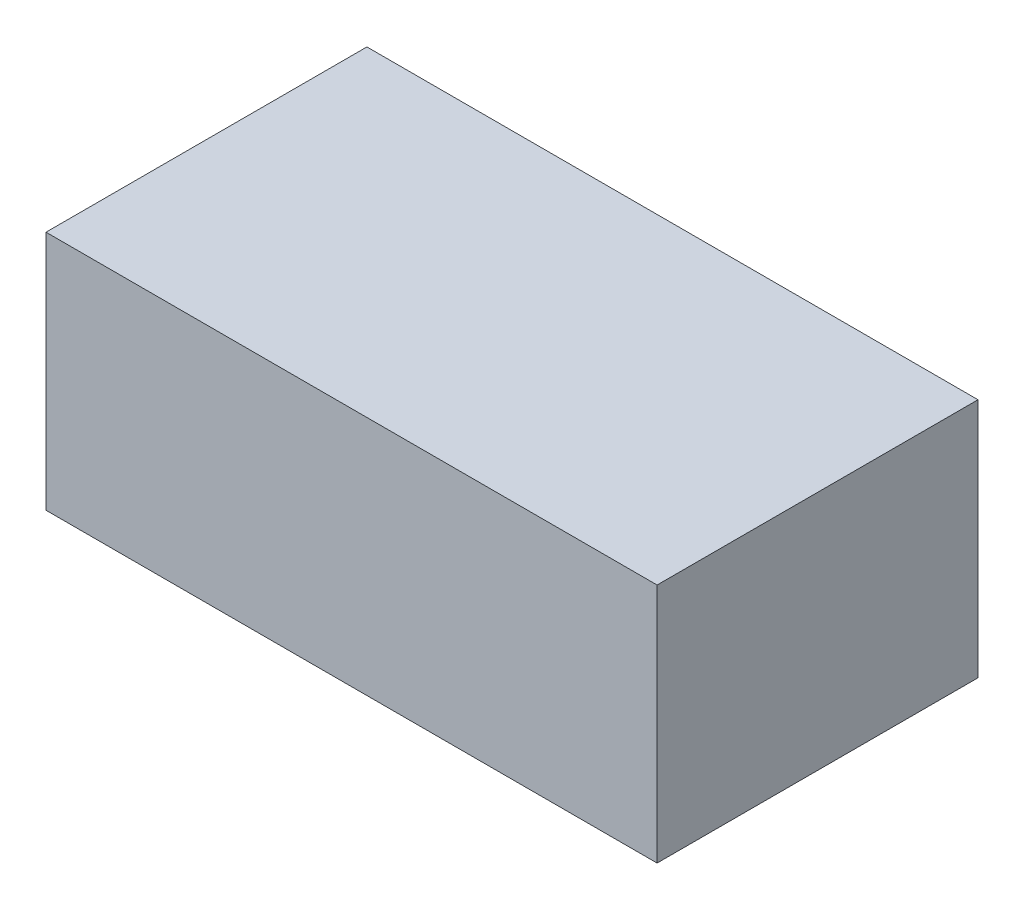
ISO-10303-21;
HEADER;
FILE_DESCRIPTION(('STEP AP214'),'2;1');
FILE_NAME('part.step','',(''),(''),'','','');
FILE_SCHEMA(('AUTOMOTIVE_DESIGN { 1 0 10303 214 1 1 1 1 }'));
ENDSEC;
DATA;
#1=APPLICATION_CONTEXT('core data for automotive mechanical design processes');
#2=APPLICATION_PROTOCOL_DEFINITION('international standard','automotive_design',2000,#1);
#3=PRODUCT_CONTEXT('',#1,'mechanical');
#4=PRODUCT('Part','Part','',(#3));
#5=PRODUCT_RELATED_PRODUCT_CATEGORY('part','',(#4));
#6=PRODUCT_DEFINITION_FORMATION('','',#4);
#7=PRODUCT_DEFINITION_CONTEXT('part definition',#1,'design');
#8=PRODUCT_DEFINITION('design','',#6,#7);
#9=PRODUCT_DEFINITION_SHAPE('','',#8);
#10=(LENGTH_UNIT() NAMED_UNIT(*) SI_UNIT(.MILLI.,.METRE.));
#11=(NAMED_UNIT(*) PLANE_ANGLE_UNIT() SI_UNIT($,.RADIAN.));
#12=(NAMED_UNIT(*) SI_UNIT($,.STERADIAN.) SOLID_ANGLE_UNIT());
#13=UNCERTAINTY_MEASURE_WITH_UNIT(LENGTH_MEASURE(1.E-05),#10,'distance_accuracy_value','');
#14=(GEOMETRIC_REPRESENTATION_CONTEXT(3) GLOBAL_UNCERTAINTY_ASSIGNED_CONTEXT((#13)) GLOBAL_UNIT_ASSIGNED_CONTEXT((#10,
#11,#12)) REPRESENTATION_CONTEXT('',''));
#15=CARTESIAN_POINT('',(0.,0.,0.));
#16=DIRECTION('',(0.,0.,1.));
#17=DIRECTION('',(1.,0.,0.));
#18=AXIS2_PLACEMENT_3D('',#15,#16,#17);
#19=CARTESIAN_POINT('',(-5.075,4.,2.665));
#20=DIRECTION('',(1.,0.,0.));
#21=DIRECTION('',(0.,0.,-1.));
#22=AXIS2_PLACEMENT_3D('',#19,#20,#21);
#23=PLANE('',#22);
#24=DIRECTION('',(0.,0.,1.));
#25=VECTOR('',#24,1.);
#26=CARTESIAN_POINT('',(-5.075,0.,2.665));
#27=LINE('',#26,#25);
#28=CARTESIAN_POINT('',(-5.075,0.,-2.665));
#29=VERTEX_POINT('',#28);
#30=CARTESIAN_POINT('',(-5.075,0.,2.665));
#31=VERTEX_POINT('',#30);
#32=EDGE_CURVE('E97',#29,#31,#27,.T.);
#33=ORIENTED_EDGE('',*,*,#32,.T.);
#34=DIRECTION('',(0.,-1.,0.));
#35=VECTOR('',#34,1.);
#36=CARTESIAN_POINT('',(-5.075,4.,2.665));
#37=LINE('',#36,#35);
#38=CARTESIAN_POINT('',(-5.075,4.,2.665));
#39=VERTEX_POINT('',#38);
#40=EDGE_CURVE('E11',#39,#31,#37,.T.);
#41=ORIENTED_EDGE('',*,*,#40,.F.);
#42=DIRECTION('',(0.,0.,1.));
#43=VECTOR('',#42,1.);
#44=CARTESIAN_POINT('',(-5.075,4.,2.665));
#45=LINE('',#44,#43);
#46=CARTESIAN_POINT('',(-5.075,4.,-2.665));
#47=VERTEX_POINT('',#46);
#48=EDGE_CURVE('E85',#47,#39,#45,.T.);
#49=ORIENTED_EDGE('',*,*,#48,.F.);
#50=DIRECTION('',(0.,-1.,0.));
#51=VECTOR('',#50,1.);
#52=CARTESIAN_POINT('',(-5.075,4.,-2.665));
#53=LINE('',#52,#51);
#54=EDGE_CURVE('E93',#47,#29,#53,.T.);
#55=ORIENTED_EDGE('',*,*,#54,.T.);
#56=EDGE_LOOP('',(#33,#41,#49,#55));
#57=FACE_BOUND('',#56,.T.);
#58=ADVANCED_FACE('F34',(#57),#23,.F.);
#59=CARTESIAN_POINT('',(5.075,4.,2.665));
#60=DIRECTION('',(0.,0.,-1.));
#61=DIRECTION('',(-1.,0.,0.));
#62=AXIS2_PLACEMENT_3D('',#59,#60,#61);
#63=PLANE('',#62);
#64=DIRECTION('',(1.,0.,0.));
#65=VECTOR('',#64,1.);
#66=CARTESIAN_POINT('',(5.075,0.,2.665));
#67=LINE('',#66,#65);
#68=CARTESIAN_POINT('',(5.075,0.,2.665));
#69=VERTEX_POINT('',#68);
#70=EDGE_CURVE('E89',#31,#69,#67,.T.);
#71=ORIENTED_EDGE('',*,*,#70,.T.);
#72=DIRECTION('',(0.,-1.,0.));
#73=VECTOR('',#72,1.);
#74=CARTESIAN_POINT('',(5.075,4.,2.665));
#75=LINE('',#74,#73);
#76=CARTESIAN_POINT('',(5.075,4.,2.665));
#77=VERTEX_POINT('',#76);
#78=EDGE_CURVE('E42',#77,#69,#75,.T.);
#79=ORIENTED_EDGE('',*,*,#78,.F.);
#80=DIRECTION('',(1.,0.,0.));
#81=VECTOR('',#80,1.);
#82=CARTESIAN_POINT('',(5.075,4.,2.665));
#83=LINE('',#82,#81);
#84=EDGE_CURVE('E80',#39,#77,#83,.T.);
#85=ORIENTED_EDGE('',*,*,#84,.F.);
#86=ORIENTED_EDGE('',*,*,#40,.T.);
#87=EDGE_LOOP('',(#71,#79,#85,#86));
#88=FACE_BOUND('',#87,.T.);
#89=ADVANCED_FACE('F88',(#88),#63,.F.);
#90=CARTESIAN_POINT('',(5.075,4.,2.665));
#91=DIRECTION('',(-1.,0.,0.));
#92=DIRECTION('',(0.,0.,1.));
#93=AXIS2_PLACEMENT_3D('',#90,#91,#92);
#94=PLANE('',#93);
#95=DIRECTION('',(0.,0.,-1.));
#96=VECTOR('',#95,1.);
#97=CARTESIAN_POINT('',(5.075,0.,2.665));
#98=LINE('',#97,#96);
#99=CARTESIAN_POINT('',(5.075,0.,-2.665));
#100=VERTEX_POINT('',#99);
#101=EDGE_CURVE('E67',#69,#100,#98,.T.);
#102=ORIENTED_EDGE('',*,*,#101,.T.);
#103=DIRECTION('',(0.,-1.,0.));
#104=VECTOR('',#103,1.);
#105=CARTESIAN_POINT('',(5.075,4.,-2.665));
#106=LINE('',#105,#104);
#107=CARTESIAN_POINT('',(5.075,4.,-2.665));
#108=VERTEX_POINT('',#107);
#109=EDGE_CURVE('E90',#108,#100,#106,.T.);
#110=ORIENTED_EDGE('',*,*,#109,.F.);
#111=DIRECTION('',(0.,0.,-1.));
#112=VECTOR('',#111,1.);
#113=CARTESIAN_POINT('',(5.075,4.,2.665));
#114=LINE('',#113,#112);
#115=EDGE_CURVE('E83',#77,#108,#114,.T.);
#116=ORIENTED_EDGE('',*,*,#115,.F.);
#117=ORIENTED_EDGE('',*,*,#78,.T.);
#118=EDGE_LOOP('',(#102,#110,#116,#117));
#119=FACE_BOUND('',#118,.T.);
#120=ADVANCED_FACE('F91',(#119),#94,.F.);
#121=CARTESIAN_POINT('',(5.075,4.,-2.665));
#122=DIRECTION('',(0.,0.,1.));
#123=DIRECTION('',(1.,0.,0.));
#124=AXIS2_PLACEMENT_3D('',#121,#122,#123);
#125=PLANE('',#124);
#126=DIRECTION('',(-1.,0.,0.));
#127=VECTOR('',#126,1.);
#128=CARTESIAN_POINT('',(5.075,0.,-2.665));
#129=LINE('',#128,#127);
#130=EDGE_CURVE('E73',#100,#29,#129,.T.);
#131=ORIENTED_EDGE('',*,*,#130,.T.);
#132=ORIENTED_EDGE('',*,*,#54,.F.);
#133=DIRECTION('',(-1.,0.,0.));
#134=VECTOR('',#133,1.);
#135=CARTESIAN_POINT('',(5.075,4.,-2.665));
#136=LINE('',#135,#134);
#137=EDGE_CURVE('E50',#108,#47,#136,.T.);
#138=ORIENTED_EDGE('',*,*,#137,.F.);
#139=ORIENTED_EDGE('',*,*,#109,.T.);
#140=EDGE_LOOP('',(#131,#132,#138,#139));
#141=FACE_BOUND('',#140,.T.);
#142=ADVANCED_FACE('F104',(#141),#125,.F.);
#143=CARTESIAN_POINT('',(0.,4.,0.));
#144=DIRECTION('',(0.,1.,0.));
#145=DIRECTION('',(0.,0.,1.));
#146=AXIS2_PLACEMENT_3D('',#143,#144,#145);
#147=PLANE('',#146);
#148=ORIENTED_EDGE('',*,*,#48,.T.);
#149=ORIENTED_EDGE('',*,*,#84,.T.);
#150=ORIENTED_EDGE('',*,*,#115,.T.);
#151=ORIENTED_EDGE('',*,*,#137,.T.);
#152=EDGE_LOOP('',(#148,#149,#150,#151));
#153=FACE_BOUND('',#152,.T.);
#154=ADVANCED_FACE('F81',(#153),#147,.T.);
#155=CARTESIAN_POINT('',(0.,0.,0.));
#156=DIRECTION('',(0.,1.,0.));
#157=DIRECTION('',(0.,0.,1.));
#158=AXIS2_PLACEMENT_3D('',#155,#156,#157);
#159=PLANE('',#158);
#160=ORIENTED_EDGE('',*,*,#32,.F.);
#161=ORIENTED_EDGE('',*,*,#130,.F.);
#162=ORIENTED_EDGE('',*,*,#101,.F.);
#163=ORIENTED_EDGE('',*,*,#70,.F.);
#164=EDGE_LOOP('',(#160,#161,#162,#163));
#165=FACE_BOUND('',#164,.T.);
#166=ADVANCED_FACE('F107',(#165),#159,.F.);
#167=CLOSED_SHELL('',(#58,#89,#120,#142,#154,#166));
#168=MANIFOLD_SOLID_BREP('B2',#167);
#169=ADVANCED_BREP_SHAPE_REPRESENTATION('',(#18,#168),#14);
#170=SHAPE_DEFINITION_REPRESENTATION(#9,#169);
ENDSEC;
END-ISO-10303-21;
